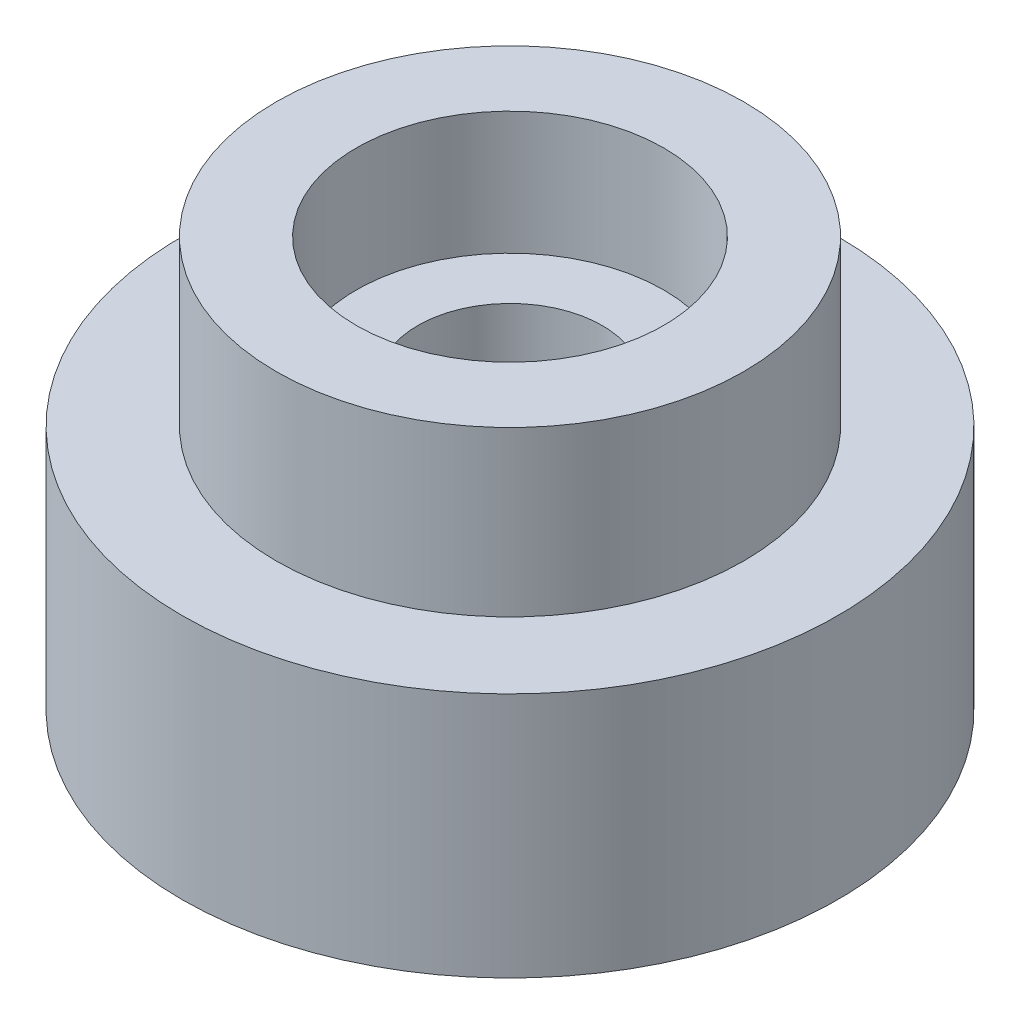
ISO-10303-21;
HEADER;
FILE_DESCRIPTION(('STEP AP214'),'2;1');
FILE_NAME('part.step','',(''),(''),'','','');
FILE_SCHEMA(('AUTOMOTIVE_DESIGN { 1 0 10303 214 1 1 1 1 }'));
ENDSEC;
DATA;
#1=APPLICATION_CONTEXT('core data for automotive mechanical design processes');
#2=APPLICATION_PROTOCOL_DEFINITION('international standard','automotive_design',2000,#1);
#3=PRODUCT_CONTEXT('',#1,'mechanical');
#4=PRODUCT('Part','Part','',(#3));
#5=PRODUCT_RELATED_PRODUCT_CATEGORY('part','',(#4));
#6=PRODUCT_DEFINITION_FORMATION('','',#4);
#7=PRODUCT_DEFINITION_CONTEXT('part definition',#1,'design');
#8=PRODUCT_DEFINITION('design','',#6,#7);
#9=PRODUCT_DEFINITION_SHAPE('','',#8);
#10=(LENGTH_UNIT() NAMED_UNIT(*) SI_UNIT(.MILLI.,.METRE.));
#11=(NAMED_UNIT(*) PLANE_ANGLE_UNIT() SI_UNIT($,.RADIAN.));
#12=(NAMED_UNIT(*) SI_UNIT($,.STERADIAN.) SOLID_ANGLE_UNIT());
#13=UNCERTAINTY_MEASURE_WITH_UNIT(LENGTH_MEASURE(1.E-05),#10,'distance_accuracy_value','');
#14=(GEOMETRIC_REPRESENTATION_CONTEXT(3) GLOBAL_UNCERTAINTY_ASSIGNED_CONTEXT((#13)) GLOBAL_UNIT_ASSIGNED_CONTEXT((#10,
#11,#12)) REPRESENTATION_CONTEXT('',''));
#15=CARTESIAN_POINT('',(0.,0.,0.));
#16=DIRECTION('',(0.,0.,1.));
#17=DIRECTION('',(1.,0.,0.));
#18=AXIS2_PLACEMENT_3D('',#15,#16,#17);
#19=CARTESIAN_POINT('',(0.,0.,0.));
#20=DIRECTION('',(0.,1.,0.));
#21=DIRECTION('',(0.,0.,1.));
#22=AXIS2_PLACEMENT_3D('',#19,#20,#21);
#23=CYLINDRICAL_SURFACE('',#22,1.125);
#24=CARTESIAN_POINT('',(0.,0.,0.));
#25=DIRECTION('',(0.,1.,0.));
#26=DIRECTION('',(0.,0.,1.));
#27=AXIS2_PLACEMENT_3D('',#24,#25,#26);
#28=CIRCLE('',#27,1.125);
#29=CARTESIAN_POINT('',(0.,0.,1.125));
#30=VERTEX_POINT('',#29);
#31=EDGE_CURVE('E49',#30,#30,#28,.T.);
#32=ORIENTED_EDGE('',*,*,#31,.F.);
#33=EDGE_LOOP('',(#32));
#34=FACE_BOUND('',#33,.T.);
#35=CARTESIAN_POINT('',(0.,3.5,0.));
#36=DIRECTION('',(0.,1.,0.));
#37=DIRECTION('',(0.,0.,1.));
#38=AXIS2_PLACEMENT_3D('',#35,#36,#37);
#39=CIRCLE('',#38,1.125);
#40=CARTESIAN_POINT('',(0.,3.5,1.125));
#41=VERTEX_POINT('',#40);
#42=EDGE_CURVE('E35',#41,#41,#39,.F.);
#43=ORIENTED_EDGE('',*,*,#42,.F.);
#44=EDGE_LOOP('',(#43));
#45=FACE_BOUND('',#44,.T.);
#46=ADVANCED_FACE('F31',(#34,#45),#23,.F.);
#47=CARTESIAN_POINT('',(0.,3.,0.));
#48=DIRECTION('',(0.,-1.,0.));
#49=DIRECTION('',(0.,0.,-1.));
#50=AXIS2_PLACEMENT_3D('',#47,#48,#49);
#51=CYLINDRICAL_SURFACE('',#50,4.);
#52=CARTESIAN_POINT('',(0.,3.,0.));
#53=DIRECTION('',(0.,1.,0.));
#54=DIRECTION('',(0.,0.,1.));
#55=AXIS2_PLACEMENT_3D('',#52,#53,#54);
#56=CIRCLE('',#55,4.);
#57=CARTESIAN_POINT('',(0.,3.,4.));
#58=VERTEX_POINT('',#57);
#59=EDGE_CURVE('E10',#58,#58,#56,.T.);
#60=ORIENTED_EDGE('',*,*,#59,.F.);
#61=EDGE_LOOP('',(#60));
#62=FACE_BOUND('',#61,.T.);
#63=CARTESIAN_POINT('',(0.,0.,0.));
#64=DIRECTION('',(0.,1.,0.));
#65=DIRECTION('',(0.,0.,1.));
#66=AXIS2_PLACEMENT_3D('',#63,#64,#65);
#67=CIRCLE('',#66,4.);
#68=CARTESIAN_POINT('',(0.,0.,4.));
#69=VERTEX_POINT('',#68);
#70=EDGE_CURVE('E39',#69,#69,#67,.T.);
#71=ORIENTED_EDGE('',*,*,#70,.T.);
#72=EDGE_LOOP('',(#71));
#73=FACE_BOUND('',#72,.T.);
#74=ADVANCED_FACE('F33',(#62,#73),#51,.T.);
#75=CARTESIAN_POINT('',(0.,3.,0.));
#76=DIRECTION('',(0.,1.,0.));
#77=DIRECTION('',(0.,0.,1.));
#78=AXIS2_PLACEMENT_3D('',#75,#76,#77);
#79=PLANE('',#78);
#80=CARTESIAN_POINT('',(0.,3.,0.));
#81=DIRECTION('',(0.,1.,0.));
#82=DIRECTION('',(0.,0.,1.));
#83=AXIS2_PLACEMENT_3D('',#80,#81,#82);
#84=CIRCLE('',#83,2.85);
#85=CARTESIAN_POINT('',(0.,3.,2.85));
#86=VERTEX_POINT('',#85);
#87=EDGE_CURVE('E46',#86,#86,#84,.T.);
#88=ORIENTED_EDGE('',*,*,#87,.F.);
#89=EDGE_LOOP('',(#88));
#90=FACE_BOUND('',#89,.T.);
#91=ORIENTED_EDGE('',*,*,#59,.T.);
#92=EDGE_LOOP('',(#91));
#93=FACE_BOUND('',#92,.T.);
#94=ADVANCED_FACE('F72',(#90,#93),#79,.T.);
#95=CARTESIAN_POINT('',(0.,0.,0.));
#96=DIRECTION('',(0.,1.,0.));
#97=DIRECTION('',(0.,0.,1.));
#98=AXIS2_PLACEMENT_3D('',#95,#96,#97);
#99=PLANE('',#98);
#100=ORIENTED_EDGE('',*,*,#31,.T.);
#101=EDGE_LOOP('',(#100));
#102=FACE_BOUND('',#101,.T.);
#103=ORIENTED_EDGE('',*,*,#70,.F.);
#104=EDGE_LOOP('',(#103));
#105=FACE_BOUND('',#104,.T.);
#106=ADVANCED_FACE('F86',(#102,#105),#99,.F.);
#107=CARTESIAN_POINT('',(0.,5.,0.));
#108=DIRECTION('',(0.,-1.,0.));
#109=DIRECTION('',(0.,0.,-1.));
#110=AXIS2_PLACEMENT_3D('',#107,#108,#109);
#111=CYLINDRICAL_SURFACE('',#110,2.85);
#112=CARTESIAN_POINT('',(0.,5.,0.));
#113=DIRECTION('',(0.,1.,0.));
#114=DIRECTION('',(0.,0.,1.));
#115=AXIS2_PLACEMENT_3D('',#112,#113,#114);
#116=CIRCLE('',#115,2.85);
#117=CARTESIAN_POINT('',(0.,5.,2.85));
#118=VERTEX_POINT('',#117);
#119=EDGE_CURVE('E44',#118,#118,#116,.T.);
#120=ORIENTED_EDGE('',*,*,#119,.F.);
#121=EDGE_LOOP('',(#120));
#122=FACE_BOUND('',#121,.T.);
#123=ORIENTED_EDGE('',*,*,#87,.T.);
#124=EDGE_LOOP('',(#123));
#125=FACE_BOUND('',#124,.T.);
#126=ADVANCED_FACE('F82',(#122,#125),#111,.T.);
#127=CARTESIAN_POINT('',(0.,5.,0.));
#128=DIRECTION('',(0.,1.,0.));
#129=DIRECTION('',(0.,0.,1.));
#130=AXIS2_PLACEMENT_3D('',#127,#128,#129);
#131=PLANE('',#130);
#132=CARTESIAN_POINT('',(0.,5.,0.));
#133=DIRECTION('',(0.,1.,0.));
#134=DIRECTION('',(0.,0.,1.));
#135=AXIS2_PLACEMENT_3D('',#132,#133,#134);
#136=CIRCLE('',#135,1.875);
#137=CARTESIAN_POINT('',(0.,5.,1.875));
#138=VERTEX_POINT('',#137);
#139=EDGE_CURVE('E54',#138,#138,#136,.T.);
#140=ORIENTED_EDGE('',*,*,#139,.F.);
#141=EDGE_LOOP('',(#140));
#142=FACE_BOUND('',#141,.T.);
#143=ORIENTED_EDGE('',*,*,#119,.T.);
#144=EDGE_LOOP('',(#143));
#145=FACE_BOUND('',#144,.T.);
#146=ADVANCED_FACE('F79',(#142,#145),#131,.T.);
#147=CARTESIAN_POINT('',(0.,3.5,0.));
#148=DIRECTION('',(0.,1.,0.));
#149=DIRECTION('',(0.,0.,1.));
#150=AXIS2_PLACEMENT_3D('',#147,#148,#149);
#151=PLANE('',#150);
#152=CARTESIAN_POINT('',(0.,3.5,0.));
#153=DIRECTION('',(0.,1.,0.));
#154=DIRECTION('',(0.,0.,1.));
#155=AXIS2_PLACEMENT_3D('',#152,#153,#154);
#156=CIRCLE('',#155,1.875);
#157=CARTESIAN_POINT('',(0.,3.5,1.875));
#158=VERTEX_POINT('',#157);
#159=EDGE_CURVE('E57',#158,#158,#156,.T.);
#160=ORIENTED_EDGE('',*,*,#159,.T.);
#161=EDGE_LOOP('',(#160));
#162=FACE_BOUND('',#161,.T.);
#163=ORIENTED_EDGE('',*,*,#42,.T.);
#164=EDGE_LOOP('',(#163));
#165=FACE_BOUND('',#164,.T.);
#166=ADVANCED_FACE('F64',(#162,#165),#151,.T.);
#167=CARTESIAN_POINT('',(0.,3.5,0.));
#168=DIRECTION('',(0.,1.,0.));
#169=DIRECTION('',(0.,0.,1.));
#170=AXIS2_PLACEMENT_3D('',#167,#168,#169);
#171=CYLINDRICAL_SURFACE('',#170,1.875);
#172=ORIENTED_EDGE('',*,*,#159,.F.);
#173=EDGE_LOOP('',(#172));
#174=FACE_BOUND('',#173,.T.);
#175=ORIENTED_EDGE('',*,*,#139,.T.);
#176=EDGE_LOOP('',(#175));
#177=FACE_BOUND('',#176,.T.);
#178=ADVANCED_FACE('F77',(#174,#177),#171,.F.);
#179=CLOSED_SHELL('',(#46,#74,#94,#106,#126,#146,#166,#178));
#180=MANIFOLD_SOLID_BREP('B2',#179);
#181=ADVANCED_BREP_SHAPE_REPRESENTATION('',(#18,#180),#14);
#182=SHAPE_DEFINITION_REPRESENTATION(#9,#181);
ENDSEC;
END-ISO-10303-21;
